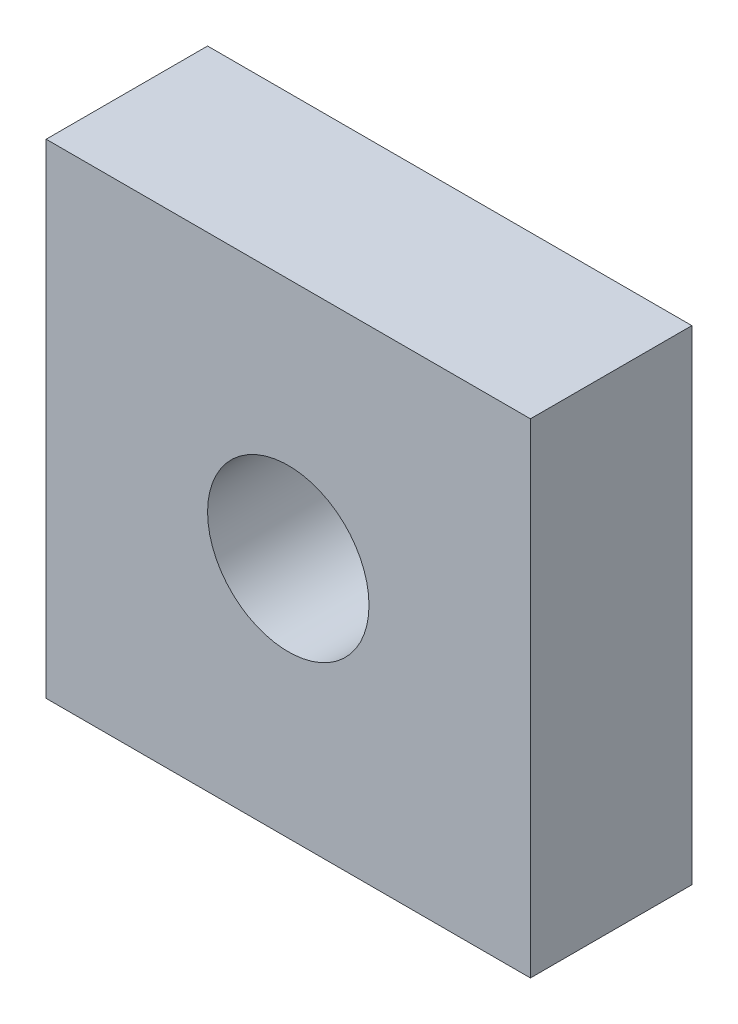
ISO-10303-21;
HEADER;
FILE_DESCRIPTION(('STEP AP214'),'2;1');
FILE_NAME('part.step','',(''),(''),'','','');
FILE_SCHEMA(('AUTOMOTIVE_DESIGN { 1 0 10303 214 1 1 1 1 }'));
ENDSEC;
DATA;
#1=APPLICATION_CONTEXT('core data for automotive mechanical design processes');
#2=APPLICATION_PROTOCOL_DEFINITION('international standard','automotive_design',2000,#1);
#3=PRODUCT_CONTEXT('',#1,'mechanical');
#4=PRODUCT('Part','Part','',(#3));
#5=PRODUCT_RELATED_PRODUCT_CATEGORY('part','',(#4));
#6=PRODUCT_DEFINITION_FORMATION('','',#4);
#7=PRODUCT_DEFINITION_CONTEXT('part definition',#1,'design');
#8=PRODUCT_DEFINITION('design','',#6,#7);
#9=PRODUCT_DEFINITION_SHAPE('','',#8);
#10=(LENGTH_UNIT() NAMED_UNIT(*) SI_UNIT(.MILLI.,.METRE.));
#11=(NAMED_UNIT(*) PLANE_ANGLE_UNIT() SI_UNIT($,.RADIAN.));
#12=(NAMED_UNIT(*) SI_UNIT($,.STERADIAN.) SOLID_ANGLE_UNIT());
#13=UNCERTAINTY_MEASURE_WITH_UNIT(LENGTH_MEASURE(1.E-05),#10,'distance_accuracy_value','');
#14=(GEOMETRIC_REPRESENTATION_CONTEXT(3) GLOBAL_UNCERTAINTY_ASSIGNED_CONTEXT((#13)) GLOBAL_UNIT_ASSIGNED_CONTEXT((#10,
#11,#12)) REPRESENTATION_CONTEXT('',''));
#15=CARTESIAN_POINT('',(0.,0.,0.));
#16=DIRECTION('',(0.,0.,1.));
#17=DIRECTION('',(1.,0.,0.));
#18=AXIS2_PLACEMENT_3D('',#15,#16,#17);
#19=CARTESIAN_POINT('',(0.,0.,2.));
#20=DIRECTION('',(1.,0.,0.));
#21=DIRECTION('',(0.,1.,0.));
#22=AXIS2_PLACEMENT_3D('',#19,#20,#21);
#23=PLANE('',#22);
#24=DIRECTION('',(0.,-1.,0.));
#25=VECTOR('',#24,1.);
#26=CARTESIAN_POINT('',(0.,0.,0.));
#27=LINE('',#26,#25);
#28=CARTESIAN_POINT('',(0.,6.,0.));
#29=VERTEX_POINT('',#28);
#30=CARTESIAN_POINT('',(0.,0.,0.));
#31=VERTEX_POINT('',#30);
#32=EDGE_CURVE('E100',#29,#31,#27,.T.);
#33=ORIENTED_EDGE('',*,*,#32,.T.);
#34=DIRECTION('',(0.,0.,-1.));
#35=VECTOR('',#34,1.);
#36=CARTESIAN_POINT('',(0.,0.,2.));
#37=LINE('',#36,#35);
#38=CARTESIAN_POINT('',(0.,0.,2.));
#39=VERTEX_POINT('',#38);
#40=EDGE_CURVE('E11',#39,#31,#37,.T.);
#41=ORIENTED_EDGE('',*,*,#40,.F.);
#42=DIRECTION('',(0.,-1.,0.));
#43=VECTOR('',#42,1.);
#44=CARTESIAN_POINT('',(0.,0.,2.));
#45=LINE('',#44,#43);
#46=CARTESIAN_POINT('',(0.,6.,2.));
#47=VERTEX_POINT('',#46);
#48=EDGE_CURVE('E88',#47,#39,#45,.T.);
#49=ORIENTED_EDGE('',*,*,#48,.F.);
#50=DIRECTION('',(0.,0.,-1.));
#51=VECTOR('',#50,1.);
#52=CARTESIAN_POINT('',(0.,6.,2.));
#53=LINE('',#52,#51);
#54=EDGE_CURVE('E96',#47,#29,#53,.T.);
#55=ORIENTED_EDGE('',*,*,#54,.T.);
#56=EDGE_LOOP('',(#33,#41,#49,#55));
#57=FACE_BOUND('',#56,.T.);
#58=ADVANCED_FACE('F37',(#57),#23,.F.);
#59=CARTESIAN_POINT('',(0.,0.,2.));
#60=DIRECTION('',(0.,1.,0.));
#61=DIRECTION('',(0.,0.,1.));
#62=AXIS2_PLACEMENT_3D('',#59,#60,#61);
#63=PLANE('',#62);
#64=DIRECTION('',(1.,0.,0.));
#65=VECTOR('',#64,1.);
#66=CARTESIAN_POINT('',(0.,0.,0.));
#67=LINE('',#66,#65);
#68=CARTESIAN_POINT('',(6.,0.,0.));
#69=VERTEX_POINT('',#68);
#70=EDGE_CURVE('E92',#31,#69,#67,.T.);
#71=ORIENTED_EDGE('',*,*,#70,.T.);
#72=DIRECTION('',(0.,0.,-1.));
#73=VECTOR('',#72,1.);
#74=CARTESIAN_POINT('',(6.,0.,2.));
#75=LINE('',#74,#73);
#76=CARTESIAN_POINT('',(6.,0.,2.));
#77=VERTEX_POINT('',#76);
#78=EDGE_CURVE('E45',#77,#69,#75,.T.);
#79=ORIENTED_EDGE('',*,*,#78,.F.);
#80=DIRECTION('',(1.,0.,0.));
#81=VECTOR('',#80,1.);
#82=CARTESIAN_POINT('',(0.,0.,2.));
#83=LINE('',#82,#81);
#84=EDGE_CURVE('E83',#39,#77,#83,.T.);
#85=ORIENTED_EDGE('',*,*,#84,.F.);
#86=ORIENTED_EDGE('',*,*,#40,.T.);
#87=EDGE_LOOP('',(#71,#79,#85,#86));
#88=FACE_BOUND('',#87,.T.);
#89=ADVANCED_FACE('F91',(#88),#63,.F.);
#90=CARTESIAN_POINT('',(6.,0.,2.));
#91=DIRECTION('',(-1.,0.,0.));
#92=DIRECTION('',(0.,-1.,0.));
#93=AXIS2_PLACEMENT_3D('',#90,#91,#92);
#94=PLANE('',#93);
#95=DIRECTION('',(0.,1.,0.));
#96=VECTOR('',#95,1.);
#97=CARTESIAN_POINT('',(6.,0.,0.));
#98=LINE('',#97,#96);
#99=CARTESIAN_POINT('',(6.,6.,0.));
#100=VERTEX_POINT('',#99);
#101=EDGE_CURVE('E70',#69,#100,#98,.T.);
#102=ORIENTED_EDGE('',*,*,#101,.T.);
#103=DIRECTION('',(0.,0.,-1.));
#104=VECTOR('',#103,1.);
#105=CARTESIAN_POINT('',(6.,6.,2.));
#106=LINE('',#105,#104);
#107=CARTESIAN_POINT('',(6.,6.,2.));
#108=VERTEX_POINT('',#107);
#109=EDGE_CURVE('E93',#108,#100,#106,.T.);
#110=ORIENTED_EDGE('',*,*,#109,.F.);
#111=DIRECTION('',(0.,1.,0.));
#112=VECTOR('',#111,1.);
#113=CARTESIAN_POINT('',(6.,0.,2.));
#114=LINE('',#113,#112);
#115=EDGE_CURVE('E86',#77,#108,#114,.T.);
#116=ORIENTED_EDGE('',*,*,#115,.F.);
#117=ORIENTED_EDGE('',*,*,#78,.T.);
#118=EDGE_LOOP('',(#102,#110,#116,#117));
#119=FACE_BOUND('',#118,.T.);
#120=ADVANCED_FACE('F94',(#119),#94,.F.);
#121=CARTESIAN_POINT('',(0.,6.,2.));
#122=DIRECTION('',(0.,-1.,0.));
#123=DIRECTION('',(0.,0.,-1.));
#124=AXIS2_PLACEMENT_3D('',#121,#122,#123);
#125=PLANE('',#124);
#126=DIRECTION('',(-1.,0.,0.));
#127=VECTOR('',#126,1.);
#128=CARTESIAN_POINT('',(0.,6.,0.));
#129=LINE('',#128,#127);
#130=EDGE_CURVE('E76',#100,#29,#129,.T.);
#131=ORIENTED_EDGE('',*,*,#130,.T.);
#132=ORIENTED_EDGE('',*,*,#54,.F.);
#133=DIRECTION('',(-1.,0.,0.));
#134=VECTOR('',#133,1.);
#135=CARTESIAN_POINT('',(0.,6.,2.));
#136=LINE('',#135,#134);
#137=EDGE_CURVE('E53',#108,#47,#136,.T.);
#138=ORIENTED_EDGE('',*,*,#137,.F.);
#139=ORIENTED_EDGE('',*,*,#109,.T.);
#140=EDGE_LOOP('',(#131,#132,#138,#139));
#141=FACE_BOUND('',#140,.T.);
#142=ADVANCED_FACE('F108',(#141),#125,.F.);
#143=CARTESIAN_POINT('',(0.,0.,2.));
#144=DIRECTION('',(0.,0.,-1.));
#145=DIRECTION('',(-1.,0.,0.));
#146=AXIS2_PLACEMENT_3D('',#143,#144,#145);
#147=PLANE('',#146);
#148=CARTESIAN_POINT('',(3.,3.,2.));
#149=DIRECTION('',(0.,0.,-1.));
#150=DIRECTION('',(-1.,0.,0.));
#151=AXIS2_PLACEMENT_3D('',#148,#149,#150);
#152=CIRCLE('',#151,1.);
#153=CARTESIAN_POINT('',(2.,3.,2.));
#154=VERTEX_POINT('',#153);
#155=EDGE_CURVE('E103',#154,#154,#152,.T.);
#156=ORIENTED_EDGE('',*,*,#155,.T.);
#157=EDGE_LOOP('',(#156));
#158=FACE_BOUND('',#157,.T.);
#159=ORIENTED_EDGE('',*,*,#48,.T.);
#160=ORIENTED_EDGE('',*,*,#84,.T.);
#161=ORIENTED_EDGE('',*,*,#115,.T.);
#162=ORIENTED_EDGE('',*,*,#137,.T.);
#163=EDGE_LOOP('',(#159,#160,#161,#162));
#164=FACE_BOUND('',#163,.T.);
#165=ADVANCED_FACE('F84',(#158,#164),#147,.F.);
#166=CARTESIAN_POINT('',(0.,0.,0.));
#167=DIRECTION('',(0.,0.,-1.));
#168=DIRECTION('',(-1.,0.,0.));
#169=AXIS2_PLACEMENT_3D('',#166,#167,#168);
#170=PLANE('',#169);
#171=CARTESIAN_POINT('',(3.,3.,0.));
#172=DIRECTION('',(0.,0.,-1.));
#173=DIRECTION('',(-1.,0.,0.));
#174=AXIS2_PLACEMENT_3D('',#171,#172,#173);
#175=CIRCLE('',#174,1.);
#176=CARTESIAN_POINT('',(2.,3.,0.));
#177=VERTEX_POINT('',#176);
#178=EDGE_CURVE('E114',#177,#177,#175,.T.);
#179=ORIENTED_EDGE('',*,*,#178,.F.);
#180=EDGE_LOOP('',(#179));
#181=FACE_BOUND('',#180,.T.);
#182=ORIENTED_EDGE('',*,*,#32,.F.);
#183=ORIENTED_EDGE('',*,*,#130,.F.);
#184=ORIENTED_EDGE('',*,*,#101,.F.);
#185=ORIENTED_EDGE('',*,*,#70,.F.);
#186=EDGE_LOOP('',(#182,#183,#184,#185));
#187=FACE_BOUND('',#186,.T.);
#188=ADVANCED_FACE('F111',(#181,#187),#170,.T.);
#189=CARTESIAN_POINT('',(3.,3.,2.));
#190=DIRECTION('',(0.,0.,-1.));
#191=DIRECTION('',(-1.,0.,0.));
#192=AXIS2_PLACEMENT_3D('',#189,#190,#191);
#193=CYLINDRICAL_SURFACE('',#192,1.);
#194=ORIENTED_EDGE('',*,*,#155,.F.);
#195=EDGE_LOOP('',(#194));
#196=FACE_BOUND('',#195,.T.);
#197=ORIENTED_EDGE('',*,*,#178,.T.);
#198=EDGE_LOOP('',(#197));
#199=FACE_BOUND('',#198,.T.);
#200=ADVANCED_FACE('F121',(#196,#199),#193,.F.);
#201=CLOSED_SHELL('',(#58,#89,#120,#142,#165,#188,#200));
#202=MANIFOLD_SOLID_BREP('B2',#201);
#203=ADVANCED_BREP_SHAPE_REPRESENTATION('',(#18,#202),#14);
#204=SHAPE_DEFINITION_REPRESENTATION(#9,#203);
ENDSEC;
END-ISO-10303-21;
